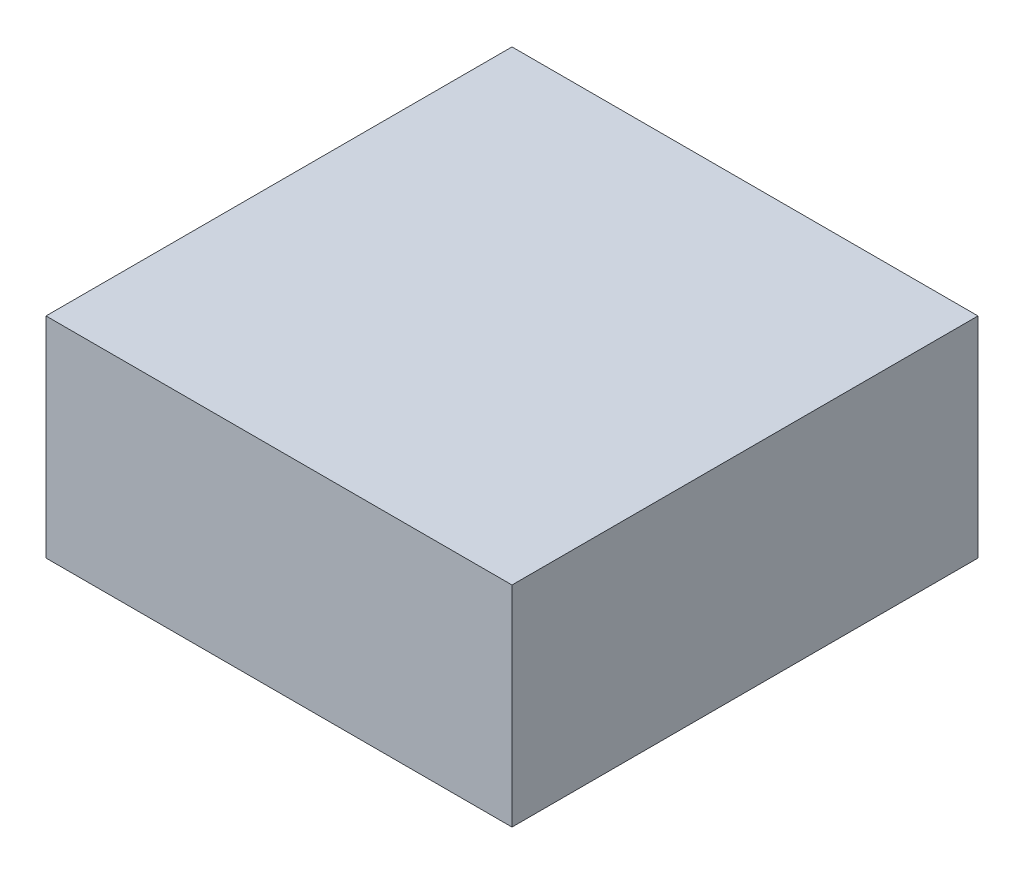
ISO-10303-21;
HEADER;
FILE_DESCRIPTION(('STEP AP214'),'2;1');
FILE_NAME('part.step','',(''),(''),'','','');
FILE_SCHEMA(('AUTOMOTIVE_DESIGN { 1 0 10303 214 1 1 1 1 }'));
ENDSEC;
DATA;
#1=APPLICATION_CONTEXT('core data for automotive mechanical design processes');
#2=APPLICATION_PROTOCOL_DEFINITION('international standard','automotive_design',2000,#1);
#3=PRODUCT_CONTEXT('',#1,'mechanical');
#4=PRODUCT('Part','Part','',(#3));
#5=PRODUCT_RELATED_PRODUCT_CATEGORY('part','',(#4));
#6=PRODUCT_DEFINITION_FORMATION('','',#4);
#7=PRODUCT_DEFINITION_CONTEXT('part definition',#1,'design');
#8=PRODUCT_DEFINITION('design','',#6,#7);
#9=PRODUCT_DEFINITION_SHAPE('','',#8);
#10=(LENGTH_UNIT() NAMED_UNIT(*) SI_UNIT(.MILLI.,.METRE.));
#11=(NAMED_UNIT(*) PLANE_ANGLE_UNIT() SI_UNIT($,.RADIAN.));
#12=(NAMED_UNIT(*) SI_UNIT($,.STERADIAN.) SOLID_ANGLE_UNIT());
#13=UNCERTAINTY_MEASURE_WITH_UNIT(LENGTH_MEASURE(1.E-05),#10,'distance_accuracy_value','');
#14=(GEOMETRIC_REPRESENTATION_CONTEXT(3) GLOBAL_UNCERTAINTY_ASSIGNED_CONTEXT((#13)) GLOBAL_UNIT_ASSIGNED_CONTEXT((#10,
#11,#12)) REPRESENTATION_CONTEXT('',''));
#15=CARTESIAN_POINT('',(0.,0.,0.));
#16=DIRECTION('',(0.,0.,1.));
#17=DIRECTION('',(1.,0.,0.));
#18=AXIS2_PLACEMENT_3D('',#15,#16,#17);
#19=CARTESIAN_POINT('',(-9.99999999999999,-5.,20.));
#20=DIRECTION('',(0.,1.,0.));
#21=DIRECTION('',(0.,0.,1.));
#22=AXIS2_PLACEMENT_3D('',#19,#20,#21);
#23=PLANE('',#22);
#24=DIRECTION('',(1.,0.,0.));
#25=VECTOR('',#24,1.);
#26=CARTESIAN_POINT('',(-9.99999999999999,-5.,0.));
#27=LINE('',#26,#25);
#28=CARTESIAN_POINT('',(-9.99999999999999,-5.,0.));
#29=VERTEX_POINT('',#28);
#30=CARTESIAN_POINT('',(10.,-5.,0.));
#31=VERTEX_POINT('',#30);
#32=EDGE_CURVE('E116',#29,#31,#27,.T.);
#33=ORIENTED_EDGE('',*,*,#32,.T.);
#34=DIRECTION('',(0.,0.,-1.));
#35=VECTOR('',#34,1.);
#36=CARTESIAN_POINT('',(10.,-5.,20.));
#37=LINE('',#36,#35);
#38=CARTESIAN_POINT('',(10.,-5.,20.));
#39=VERTEX_POINT('',#38);
#40=EDGE_CURVE('E11',#39,#31,#37,.T.);
#41=ORIENTED_EDGE('',*,*,#40,.F.);
#42=DIRECTION('',(1.,0.,0.));
#43=VECTOR('',#42,1.);
#44=CARTESIAN_POINT('',(-9.99999999999999,-5.,20.));
#45=LINE('',#44,#43);
#46=CARTESIAN_POINT('',(-9.99999999999999,-5.,20.));
#47=VERTEX_POINT('',#46);
#48=EDGE_CURVE('E97',#47,#39,#45,.T.);
#49=ORIENTED_EDGE('',*,*,#48,.F.);
#50=DIRECTION('',(0.,0.,-1.));
#51=VECTOR('',#50,1.);
#52=CARTESIAN_POINT('',(-9.99999999999999,-5.,20.));
#53=LINE('',#52,#51);
#54=EDGE_CURVE('E64',#47,#29,#53,.T.);
#55=ORIENTED_EDGE('',*,*,#54,.T.);
#56=EDGE_LOOP('',(#33,#41,#49,#55));
#57=FACE_BOUND('',#56,.T.);
#58=ADVANCED_FACE('F45',(#57),#23,.F.);
#59=CARTESIAN_POINT('',(10.,-5.,20.));
#60=DIRECTION('',(-1.,0.,0.));
#61=DIRECTION('',(0.,-1.,0.));
#62=AXIS2_PLACEMENT_3D('',#59,#60,#61);
#63=PLANE('',#62);
#64=DIRECTION('',(0.,1.,0.));
#65=VECTOR('',#64,1.);
#66=CARTESIAN_POINT('',(10.,-5.,0.));
#67=LINE('',#66,#65);
#68=CARTESIAN_POINT('',(9.99999999999999,4.,0.));
#69=VERTEX_POINT('',#68);
#70=EDGE_CURVE('E103',#31,#69,#67,.T.);
#71=ORIENTED_EDGE('',*,*,#70,.T.);
#72=DIRECTION('',(0.,0.,-1.));
#73=VECTOR('',#72,1.);
#74=CARTESIAN_POINT('',(9.99999999999999,4.,20.));
#75=LINE('',#74,#73);
#76=CARTESIAN_POINT('',(9.99999999999999,4.,20.));
#77=VERTEX_POINT('',#76);
#78=EDGE_CURVE('E55',#77,#69,#75,.T.);
#79=ORIENTED_EDGE('',*,*,#78,.F.);
#80=DIRECTION('',(0.,1.,0.));
#81=VECTOR('',#80,1.);
#82=CARTESIAN_POINT('',(10.,-5.,20.));
#83=LINE('',#82,#81);
#84=EDGE_CURVE('E89',#39,#77,#83,.T.);
#85=ORIENTED_EDGE('',*,*,#84,.F.);
#86=ORIENTED_EDGE('',*,*,#40,.T.);
#87=EDGE_LOOP('',(#71,#79,#85,#86));
#88=FACE_BOUND('',#87,.T.);
#89=ADVANCED_FACE('F102',(#88),#63,.F.);
#90=CARTESIAN_POINT('',(-9.99999999999999,4.,20.));
#91=DIRECTION('',(0.,1.,0.));
#92=DIRECTION('',(0.,0.,1.));
#93=AXIS2_PLACEMENT_3D('',#90,#91,#92);
#94=PLANE('',#93);
#95=DIRECTION('',(1.,0.,0.));
#96=VECTOR('',#95,1.);
#97=CARTESIAN_POINT('',(-9.99999999999999,4.,0.));
#98=LINE('',#97,#96);
#99=CARTESIAN_POINT('',(-9.99999999999999,4.,0.));
#100=VERTEX_POINT('',#99);
#101=EDGE_CURVE('E122',#100,#69,#98,.T.);
#102=ORIENTED_EDGE('',*,*,#101,.F.);
#103=DIRECTION('',(0.,0.,-1.));
#104=VECTOR('',#103,1.);
#105=CARTESIAN_POINT('',(-9.99999999999999,4.,20.));
#106=LINE('',#105,#104);
#107=CARTESIAN_POINT('',(-9.99999999999999,4.,20.));
#108=VERTEX_POINT('',#107);
#109=EDGE_CURVE('E78',#108,#100,#106,.T.);
#110=ORIENTED_EDGE('',*,*,#109,.F.);
#111=DIRECTION('',(1.,0.,0.));
#112=VECTOR('',#111,1.);
#113=CARTESIAN_POINT('',(-9.99999999999999,4.,20.));
#114=LINE('',#113,#112);
#115=EDGE_CURVE('E96',#108,#77,#114,.T.);
#116=ORIENTED_EDGE('',*,*,#115,.T.);
#117=ORIENTED_EDGE('',*,*,#78,.T.);
#118=EDGE_LOOP('',(#102,#110,#116,#117));
#119=FACE_BOUND('',#118,.T.);
#120=ADVANCED_FACE('F108',(#119),#94,.T.);
#121=CARTESIAN_POINT('',(-9.99999999999999,-5.,20.));
#122=DIRECTION('',(-1.,0.,0.));
#123=DIRECTION('',(0.,-1.,0.));
#124=AXIS2_PLACEMENT_3D('',#121,#122,#123);
#125=PLANE('',#124);
#126=DIRECTION('',(0.,1.,0.));
#127=VECTOR('',#126,1.);
#128=CARTESIAN_POINT('',(-9.99999999999999,-5.,0.));
#129=LINE('',#128,#127);
#130=EDGE_CURVE('E125',#29,#100,#129,.T.);
#131=ORIENTED_EDGE('',*,*,#130,.F.);
#132=ORIENTED_EDGE('',*,*,#54,.F.);
#133=DIRECTION('',(0.,1.,0.));
#134=VECTOR('',#133,1.);
#135=CARTESIAN_POINT('',(-9.99999999999999,-5.,20.));
#136=LINE('',#135,#134);
#137=EDGE_CURVE('E110',#47,#108,#136,.T.);
#138=ORIENTED_EDGE('',*,*,#137,.T.);
#139=ORIENTED_EDGE('',*,*,#109,.T.);
#140=EDGE_LOOP('',(#131,#132,#138,#139));
#141=FACE_BOUND('',#140,.T.);
#142=ADVANCED_FACE('F188',(#141),#125,.T.);
#143=CARTESIAN_POINT('',(0.,0.,20.));
#144=DIRECTION('',(0.,0.,1.));
#145=DIRECTION('',(1.,0.,0.));
#146=AXIS2_PLACEMENT_3D('',#143,#144,#145);
#147=PLANE('',#146);
#148=ORIENTED_EDGE('',*,*,#48,.T.);
#149=ORIENTED_EDGE('',*,*,#84,.T.);
#150=ORIENTED_EDGE('',*,*,#115,.F.);
#151=ORIENTED_EDGE('',*,*,#137,.F.);
#152=EDGE_LOOP('',(#148,#149,#150,#151));
#153=FACE_BOUND('',#152,.T.);
#154=ADVANCED_FACE('F93',(#153),#147,.T.);
#155=CARTESIAN_POINT('',(0.,0.,0.));
#156=DIRECTION('',(0.,0.,1.));
#157=DIRECTION('',(1.,0.,0.));
#158=AXIS2_PLACEMENT_3D('',#155,#156,#157);
#159=PLANE('',#158);
#160=CARTESIAN_POINT('',(-5.,0.,0.));
#161=DIRECTION('',(0.,0.,1.));
#162=DIRECTION('',(1.,0.,0.));
#163=AXIS2_PLACEMENT_3D('',#160,#161,#162);
#164=CIRCLE('',#163,2.75);
#165=CARTESIAN_POINT('',(-2.25,0.,0.));
#166=VERTEX_POINT('',#165);
#167=EDGE_CURVE('E143',#166,#166,#164,.T.);
#168=ORIENTED_EDGE('',*,*,#167,.T.);
#169=EDGE_LOOP('',(#168));
#170=FACE_BOUND('',#169,.T.);
#171=CARTESIAN_POINT('',(5.,0.,0.));
#172=DIRECTION('',(0.,0.,1.));
#173=DIRECTION('',(1.,0.,0.));
#174=AXIS2_PLACEMENT_3D('',#171,#172,#173);
#175=CIRCLE('',#174,2.75);
#176=CARTESIAN_POINT('',(7.75,0.,0.));
#177=VERTEX_POINT('',#176);
#178=EDGE_CURVE('E149',#177,#177,#175,.T.);
#179=ORIENTED_EDGE('',*,*,#178,.T.);
#180=EDGE_LOOP('',(#179));
#181=FACE_BOUND('',#180,.T.);
#182=ORIENTED_EDGE('',*,*,#32,.F.);
#183=ORIENTED_EDGE('',*,*,#130,.T.);
#184=ORIENTED_EDGE('',*,*,#101,.T.);
#185=ORIENTED_EDGE('',*,*,#70,.F.);
#186=EDGE_LOOP('',(#182,#183,#184,#185));
#187=FACE_BOUND('',#186,.T.);
#188=ADVANCED_FACE('F187',(#170,#181,#187),#159,.F.);
#189=CARTESIAN_POINT('',(5.,0.,7.));
#190=DIRECTION('',(0.,0.,-1.));
#191=DIRECTION('',(-1.,0.,0.));
#192=AXIS2_PLACEMENT_3D('',#189,#190,#191);
#193=CYLINDRICAL_SURFACE('',#192,2.75);
#194=CARTESIAN_POINT('',(5.,0.,7.));
#195=DIRECTION('',(0.,0.,1.));
#196=DIRECTION('',(1.,0.,0.));
#197=AXIS2_PLACEMENT_3D('',#194,#195,#196);
#198=CIRCLE('',#197,2.75);
#199=CARTESIAN_POINT('',(7.75,0.,7.));
#200=VERTEX_POINT('',#199);
#201=EDGE_CURVE('E155',#200,#200,#198,.T.);
#202=ORIENTED_EDGE('',*,*,#201,.T.);
#203=EDGE_LOOP('',(#202));
#204=FACE_BOUND('',#203,.T.);
#205=ORIENTED_EDGE('',*,*,#178,.F.);
#206=EDGE_LOOP('',(#205));
#207=FACE_BOUND('',#206,.T.);
#208=ADVANCED_FACE('F199',(#204,#207),#193,.F.);
#209=CARTESIAN_POINT('',(5.,0.,7.));
#210=DIRECTION('',(0.,0.,1.));
#211=DIRECTION('',(1.,0.,0.));
#212=AXIS2_PLACEMENT_3D('',#209,#210,#211);
#213=PLANE('',#212);
#214=CARTESIAN_POINT('',(5.,0.,7.));
#215=DIRECTION('',(0.,0.,1.));
#216=DIRECTION('',(1.,0.,0.));
#217=AXIS2_PLACEMENT_3D('',#214,#215,#216);
#218=CIRCLE('',#217,2.);
#219=CARTESIAN_POINT('',(7.,0.,7.));
#220=VERTEX_POINT('',#219);
#221=EDGE_CURVE('E132',#220,#220,#218,.T.);
#222=ORIENTED_EDGE('',*,*,#221,.T.);
#223=EDGE_LOOP('',(#222));
#224=FACE_BOUND('',#223,.T.);
#225=ORIENTED_EDGE('',*,*,#201,.F.);
#226=EDGE_LOOP('',(#225));
#227=FACE_BOUND('',#226,.T.);
#228=ADVANCED_FACE('F204',(#224,#227),#213,.F.);
#229=CARTESIAN_POINT('',(-5.,0.,7.));
#230=DIRECTION('',(0.,0.,-1.));
#231=DIRECTION('',(-1.,0.,0.));
#232=AXIS2_PLACEMENT_3D('',#229,#230,#231);
#233=CYLINDRICAL_SURFACE('',#232,2.75);
#234=CARTESIAN_POINT('',(-5.,0.,7.));
#235=DIRECTION('',(0.,0.,1.));
#236=DIRECTION('',(1.,0.,0.));
#237=AXIS2_PLACEMENT_3D('',#234,#235,#236);
#238=CIRCLE('',#237,2.75);
#239=CARTESIAN_POINT('',(-2.25,0.,7.));
#240=VERTEX_POINT('',#239);
#241=EDGE_CURVE('E135',#240,#240,#238,.T.);
#242=ORIENTED_EDGE('',*,*,#241,.T.);
#243=EDGE_LOOP('',(#242));
#244=FACE_BOUND('',#243,.T.);
#245=ORIENTED_EDGE('',*,*,#167,.F.);
#246=EDGE_LOOP('',(#245));
#247=FACE_BOUND('',#246,.T.);
#248=ADVANCED_FACE('F212',(#244,#247),#233,.F.);
#249=CARTESIAN_POINT('',(-5.,0.,7.));
#250=DIRECTION('',(0.,0.,1.));
#251=DIRECTION('',(1.,0.,0.));
#252=AXIS2_PLACEMENT_3D('',#249,#250,#251);
#253=PLANE('',#252);
#254=CARTESIAN_POINT('',(-5.,0.,7.));
#255=DIRECTION('',(0.,0.,1.));
#256=DIRECTION('',(1.,0.,0.));
#257=AXIS2_PLACEMENT_3D('',#254,#255,#256);
#258=CIRCLE('',#257,2.);
#259=CARTESIAN_POINT('',(-2.99999999999999,0.,7.));
#260=VERTEX_POINT('',#259);
#261=EDGE_CURVE('E48',#260,#260,#258,.T.);
#262=ORIENTED_EDGE('',*,*,#261,.T.);
#263=EDGE_LOOP('',(#262));
#264=FACE_BOUND('',#263,.T.);
#265=ORIENTED_EDGE('',*,*,#241,.F.);
#266=EDGE_LOOP('',(#265));
#267=FACE_BOUND('',#266,.T.);
#268=ADVANCED_FACE('F214',(#264,#267),#253,.F.);
#269=CARTESIAN_POINT('',(0.,0.,10.));
#270=DIRECTION('',(0.,0.,1.));
#271=DIRECTION('',(1.,0.,0.));
#272=AXIS2_PLACEMENT_3D('',#269,#270,#271);
#273=PLANE('',#272);
#274=CARTESIAN_POINT('',(5.,0.,10.));
#275=DIRECTION('',(0.,0.,1.));
#276=DIRECTION('',(1.,0.,0.));
#277=AXIS2_PLACEMENT_3D('',#274,#275,#276);
#278=CIRCLE('',#277,2.);
#279=CARTESIAN_POINT('',(7.,0.,10.));
#280=VERTEX_POINT('',#279);
#281=EDGE_CURVE('E119',#280,#280,#278,.T.);
#282=ORIENTED_EDGE('',*,*,#281,.F.);
#283=EDGE_LOOP('',(#282));
#284=FACE_BOUND('',#283,.T.);
#285=ADVANCED_FACE('F179',(#284),#273,.F.);
#286=CARTESIAN_POINT('',(5.,0.,10.));
#287=DIRECTION('',(0.,0.,-1.));
#288=DIRECTION('',(-1.,0.,0.));
#289=AXIS2_PLACEMENT_3D('',#286,#287,#288);
#290=CYLINDRICAL_SURFACE('',#289,2.);
#291=ORIENTED_EDGE('',*,*,#221,.F.);
#292=EDGE_LOOP('',(#291));
#293=FACE_BOUND('',#292,.T.);
#294=ORIENTED_EDGE('',*,*,#281,.T.);
#295=EDGE_LOOP('',(#294));
#296=FACE_BOUND('',#295,.T.);
#297=ADVANCED_FACE('F171',(#293,#296),#290,.F.);
#298=CARTESIAN_POINT('',(0.,0.,10.));
#299=DIRECTION('',(0.,0.,1.));
#300=DIRECTION('',(1.,0.,0.));
#301=AXIS2_PLACEMENT_3D('',#298,#299,#300);
#302=PLANE('',#301);
#303=CARTESIAN_POINT('',(-5.,0.,10.));
#304=DIRECTION('',(0.,0.,1.));
#305=DIRECTION('',(1.,0.,0.));
#306=AXIS2_PLACEMENT_3D('',#303,#304,#305);
#307=CIRCLE('',#306,2.);
#308=CARTESIAN_POINT('',(-2.99999999999999,0.,10.));
#309=VERTEX_POINT('',#308);
#310=EDGE_CURVE('E141',#309,#309,#307,.T.);
#311=ORIENTED_EDGE('',*,*,#310,.F.);
#312=EDGE_LOOP('',(#311));
#313=FACE_BOUND('',#312,.T.);
#314=ADVANCED_FACE('F169',(#313),#302,.F.);
#315=CARTESIAN_POINT('',(-5.,0.,10.));
#316=DIRECTION('',(0.,0.,-1.));
#317=DIRECTION('',(-1.,0.,0.));
#318=AXIS2_PLACEMENT_3D('',#315,#316,#317);
#319=CYLINDRICAL_SURFACE('',#318,2.);
#320=ORIENTED_EDGE('',*,*,#261,.F.);
#321=EDGE_LOOP('',(#320));
#322=FACE_BOUND('',#321,.T.);
#323=ORIENTED_EDGE('',*,*,#310,.T.);
#324=EDGE_LOOP('',(#323));
#325=FACE_BOUND('',#324,.T.);
#326=ADVANCED_FACE('F167',(#322,#325),#319,.F.);
#327=CLOSED_SHELL('',(#58,#89,#120,#142,#154,#188,#208,#228,#248,#268,#285,#297,#314,#326));
#328=MANIFOLD_SOLID_BREP('B2',#327);
#329=ADVANCED_BREP_SHAPE_REPRESENTATION('',(#18,#328),#14);
#330=SHAPE_DEFINITION_REPRESENTATION(#9,#329);
ENDSEC;
END-ISO-10303-21;
